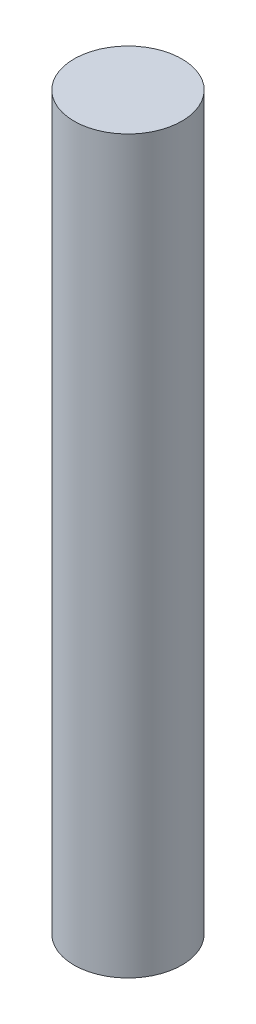
ISO-10303-21;
HEADER;
FILE_DESCRIPTION(('STEP AP214'),'2;1');
FILE_NAME('part.step','',(''),(''),'','','');
FILE_SCHEMA(('AUTOMOTIVE_DESIGN { 1 0 10303 214 1 1 1 1 }'));
ENDSEC;
DATA;
#1=APPLICATION_CONTEXT('core data for automotive mechanical design processes');
#2=APPLICATION_PROTOCOL_DEFINITION('international standard','automotive_design',2000,#1);
#3=PRODUCT_CONTEXT('',#1,'mechanical');
#4=PRODUCT('Part','Part','',(#3));
#5=PRODUCT_RELATED_PRODUCT_CATEGORY('part','',(#4));
#6=PRODUCT_DEFINITION_FORMATION('','',#4);
#7=PRODUCT_DEFINITION_CONTEXT('part definition',#1,'design');
#8=PRODUCT_DEFINITION('design','',#6,#7);
#9=PRODUCT_DEFINITION_SHAPE('','',#8);
#10=(LENGTH_UNIT() NAMED_UNIT(*) SI_UNIT(.MILLI.,.METRE.));
#11=(NAMED_UNIT(*) PLANE_ANGLE_UNIT() SI_UNIT($,.RADIAN.));
#12=(NAMED_UNIT(*) SI_UNIT($,.STERADIAN.) SOLID_ANGLE_UNIT());
#13=UNCERTAINTY_MEASURE_WITH_UNIT(LENGTH_MEASURE(1.E-05),#10,'distance_accuracy_value','');
#14=(GEOMETRIC_REPRESENTATION_CONTEXT(3) GLOBAL_UNCERTAINTY_ASSIGNED_CONTEXT((#13)) GLOBAL_UNIT_ASSIGNED_CONTEXT((#10,
#11,#12)) REPRESENTATION_CONTEXT('',''));
#15=CARTESIAN_POINT('',(0.,0.,0.));
#16=DIRECTION('',(0.,0.,1.));
#17=DIRECTION('',(1.,0.,0.));
#18=AXIS2_PLACEMENT_3D('',#15,#16,#17);
#19=CARTESIAN_POINT('',(0.,40.,0.));
#20=DIRECTION('',(0.,-1.,0.));
#21=DIRECTION('',(0.,0.,-1.));
#22=AXIS2_PLACEMENT_3D('',#19,#20,#21);
#23=CYLINDRICAL_SURFACE('',#22,2.95);
#24=CARTESIAN_POINT('',(0.,40.,0.));
#25=DIRECTION('',(0.,1.,0.));
#26=DIRECTION('',(0.,0.,1.));
#27=AXIS2_PLACEMENT_3D('',#24,#25,#26);
#28=CIRCLE('',#27,2.95);
#29=CARTESIAN_POINT('',(0.,40.,2.95));
#30=VERTEX_POINT('',#29);
#31=EDGE_CURVE('E10',#30,#30,#28,.T.);
#32=ORIENTED_EDGE('',*,*,#31,.F.);
#33=EDGE_LOOP('',(#32));
#34=FACE_BOUND('',#33,.T.);
#35=CARTESIAN_POINT('',(0.,0.,0.));
#36=DIRECTION('',(0.,1.,0.));
#37=DIRECTION('',(0.,0.,1.));
#38=AXIS2_PLACEMENT_3D('',#35,#36,#37);
#39=CIRCLE('',#38,2.95);
#40=CARTESIAN_POINT('',(0.,0.,2.95));
#41=VERTEX_POINT('',#40);
#42=EDGE_CURVE('E44',#41,#41,#39,.T.);
#43=ORIENTED_EDGE('',*,*,#42,.T.);
#44=EDGE_LOOP('',(#43));
#45=FACE_BOUND('',#44,.T.);
#46=ADVANCED_FACE('F41',(#34,#45),#23,.T.);
#47=CARTESIAN_POINT('',(0.,40.,0.));
#48=DIRECTION('',(0.,1.,0.));
#49=DIRECTION('',(0.,0.,1.));
#50=AXIS2_PLACEMENT_3D('',#47,#48,#49);
#51=PLANE('',#50);
#52=ORIENTED_EDGE('',*,*,#31,.T.);
#53=EDGE_LOOP('',(#52));
#54=FACE_BOUND('',#53,.T.);
#55=ADVANCED_FACE('F58',(#54),#51,.T.);
#56=CARTESIAN_POINT('',(0.,0.,0.));
#57=DIRECTION('',(0.,1.,0.));
#58=DIRECTION('',(0.,0.,1.));
#59=AXIS2_PLACEMENT_3D('',#56,#57,#58);
#60=PLANE('',#59);
#61=ORIENTED_EDGE('',*,*,#42,.F.);
#62=EDGE_LOOP('',(#61));
#63=FACE_BOUND('',#62,.T.);
#64=ADVANCED_FACE('F56',(#63),#60,.F.);
#65=CLOSED_SHELL('',(#46,#55,#64));
#66=MANIFOLD_SOLID_BREP('B2',#65);
#67=ADVANCED_BREP_SHAPE_REPRESENTATION('',(#18,#66),#14);
#68=SHAPE_DEFINITION_REPRESENTATION(#9,#67);
ENDSEC;
END-ISO-10303-21;
